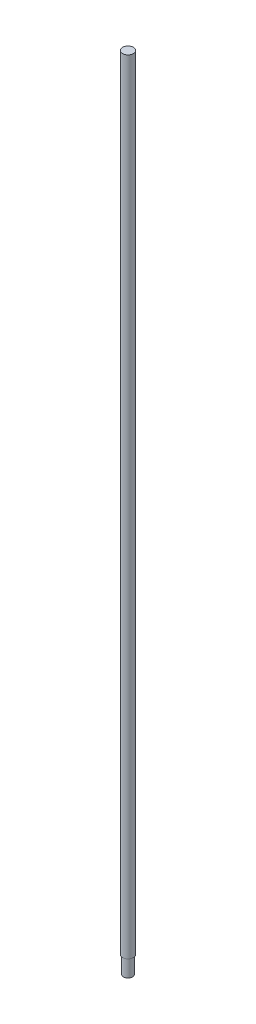
ISO-10303-21;
HEADER;
FILE_DESCRIPTION(('STEP AP214'),'2;1');
FILE_NAME('part.step','',(''),(''),'','','');
FILE_SCHEMA(('AUTOMOTIVE_DESIGN { 1 0 10303 214 1 1 1 1 }'));
ENDSEC;
DATA;
#1=APPLICATION_CONTEXT('core data for automotive mechanical design processes');
#2=APPLICATION_PROTOCOL_DEFINITION('international standard','automotive_design',2000,#1);
#3=PRODUCT_CONTEXT('',#1,'mechanical');
#4=PRODUCT('Part','Part','',(#3));
#5=PRODUCT_RELATED_PRODUCT_CATEGORY('part','',(#4));
#6=PRODUCT_DEFINITION_FORMATION('','',#4);
#7=PRODUCT_DEFINITION_CONTEXT('part definition',#1,'design');
#8=PRODUCT_DEFINITION('design','',#6,#7);
#9=PRODUCT_DEFINITION_SHAPE('','',#8);
#10=(LENGTH_UNIT() NAMED_UNIT(*) SI_UNIT(.MILLI.,.METRE.));
#11=(NAMED_UNIT(*) PLANE_ANGLE_UNIT() SI_UNIT($,.RADIAN.));
#12=(NAMED_UNIT(*) SI_UNIT($,.STERADIAN.) SOLID_ANGLE_UNIT());
#13=UNCERTAINTY_MEASURE_WITH_UNIT(LENGTH_MEASURE(1.E-05),#10,'distance_accuracy_value','');
#14=(GEOMETRIC_REPRESENTATION_CONTEXT(3) GLOBAL_UNCERTAINTY_ASSIGNED_CONTEXT((#13)) GLOBAL_UNIT_ASSIGNED_CONTEXT((#10,
#11,#12)) REPRESENTATION_CONTEXT('',''));
#15=CARTESIAN_POINT('',(0.,0.,0.));
#16=DIRECTION('',(0.,0.,1.));
#17=DIRECTION('',(1.,0.,0.));
#18=AXIS2_PLACEMENT_3D('',#15,#16,#17);
#19=CARTESIAN_POINT('',(0.,685.,0.));
#20=DIRECTION('',(0.,-1.,0.));
#21=DIRECTION('',(0.,0.,-1.));
#22=AXIS2_PLACEMENT_3D('',#19,#20,#21);
#23=CYLINDRICAL_SURFACE('',#22,4.7625);
#24=CARTESIAN_POINT('',(0.,685.,0.));
#25=DIRECTION('',(0.,1.,0.));
#26=DIRECTION('',(0.,0.,1.));
#27=AXIS2_PLACEMENT_3D('',#24,#25,#26);
#28=CIRCLE('',#27,4.7625);
#29=CARTESIAN_POINT('',(0.,685.,4.7625));
#30=VERTEX_POINT('',#29);
#31=EDGE_CURVE('E37',#30,#30,#28,.T.);
#32=ORIENTED_EDGE('',*,*,#31,.F.);
#33=EDGE_LOOP('',(#32));
#34=FACE_BOUND('',#33,.T.);
#35=CARTESIAN_POINT('',(0.,0.,0.));
#36=DIRECTION('',(0.,1.,0.));
#37=DIRECTION('',(0.,0.,1.));
#38=AXIS2_PLACEMENT_3D('',#35,#36,#37);
#39=CIRCLE('',#38,4.7625);
#40=CARTESIAN_POINT('',(0.,0.,4.7625));
#41=VERTEX_POINT('',#40);
#42=EDGE_CURVE('E33',#41,#41,#39,.T.);
#43=ORIENTED_EDGE('',*,*,#42,.T.);
#44=EDGE_LOOP('',(#43));
#45=FACE_BOUND('',#44,.T.);
#46=ADVANCED_FACE('F30',(#34,#45),#23,.T.);
#47=CARTESIAN_POINT('',(0.,685.,0.));
#48=DIRECTION('',(0.,1.,0.));
#49=DIRECTION('',(0.,0.,1.));
#50=AXIS2_PLACEMENT_3D('',#47,#48,#49);
#51=PLANE('',#50);
#52=ORIENTED_EDGE('',*,*,#31,.T.);
#53=EDGE_LOOP('',(#52));
#54=FACE_BOUND('',#53,.T.);
#55=ADVANCED_FACE('F54',(#54),#51,.T.);
#56=CARTESIAN_POINT('',(0.,0.,0.));
#57=DIRECTION('',(0.,1.,0.));
#58=DIRECTION('',(0.,0.,1.));
#59=AXIS2_PLACEMENT_3D('',#56,#57,#58);
#60=PLANE('',#59);
#61=CARTESIAN_POINT('',(0.,0.,0.));
#62=DIRECTION('',(0.,-1.,0.));
#63=DIRECTION('',(0.,0.,-1.));
#64=AXIS2_PLACEMENT_3D('',#61,#62,#63);
#65=CIRCLE('',#64,4.);
#66=CARTESIAN_POINT('',(0.,0.,-4.));
#67=VERTEX_POINT('',#66);
#68=EDGE_CURVE('E10',#67,#67,#65,.T.);
#69=ORIENTED_EDGE('',*,*,#68,.F.);
#70=EDGE_LOOP('',(#69));
#71=FACE_BOUND('',#70,.T.);
#72=ORIENTED_EDGE('',*,*,#42,.F.);
#73=EDGE_LOOP('',(#72));
#74=FACE_BOUND('',#73,.T.);
#75=ADVANCED_FACE('F51',(#71,#74),#60,.F.);
#76=CARTESIAN_POINT('',(0.,-15.,0.));
#77=DIRECTION('',(0.,1.,0.));
#78=DIRECTION('',(0.,0.,1.));
#79=AXIS2_PLACEMENT_3D('',#76,#77,#78);
#80=CYLINDRICAL_SURFACE('',#79,4.);
#81=CARTESIAN_POINT('',(0.,-15.,0.));
#82=DIRECTION('',(0.,-1.,0.));
#83=DIRECTION('',(0.,0.,-1.));
#84=AXIS2_PLACEMENT_3D('',#81,#82,#83);
#85=CIRCLE('',#84,4.);
#86=CARTESIAN_POINT('',(0.,-15.,-4.));
#87=VERTEX_POINT('',#86);
#88=EDGE_CURVE('E43',#87,#87,#85,.T.);
#89=ORIENTED_EDGE('',*,*,#88,.F.);
#90=EDGE_LOOP('',(#89));
#91=FACE_BOUND('',#90,.T.);
#92=ORIENTED_EDGE('',*,*,#68,.T.);
#93=EDGE_LOOP('',(#92));
#94=FACE_BOUND('',#93,.T.);
#95=ADVANCED_FACE('F53',(#91,#94),#80,.T.);
#96=CARTESIAN_POINT('',(0.,-15.,0.));
#97=DIRECTION('',(0.,-1.,0.));
#98=DIRECTION('',(0.,0.,-1.));
#99=AXIS2_PLACEMENT_3D('',#96,#97,#98);
#100=PLANE('',#99);
#101=ORIENTED_EDGE('',*,*,#88,.T.);
#102=EDGE_LOOP('',(#101));
#103=FACE_BOUND('',#102,.T.);
#104=ADVANCED_FACE('F60',(#103),#100,.T.);
#105=CLOSED_SHELL('',(#46,#55,#75,#95,#104));
#106=MANIFOLD_SOLID_BREP('B2',#105);
#107=ADVANCED_BREP_SHAPE_REPRESENTATION('',(#18,#106),#14);
#108=SHAPE_DEFINITION_REPRESENTATION(#9,#107);
ENDSEC;
END-ISO-10303-21;
